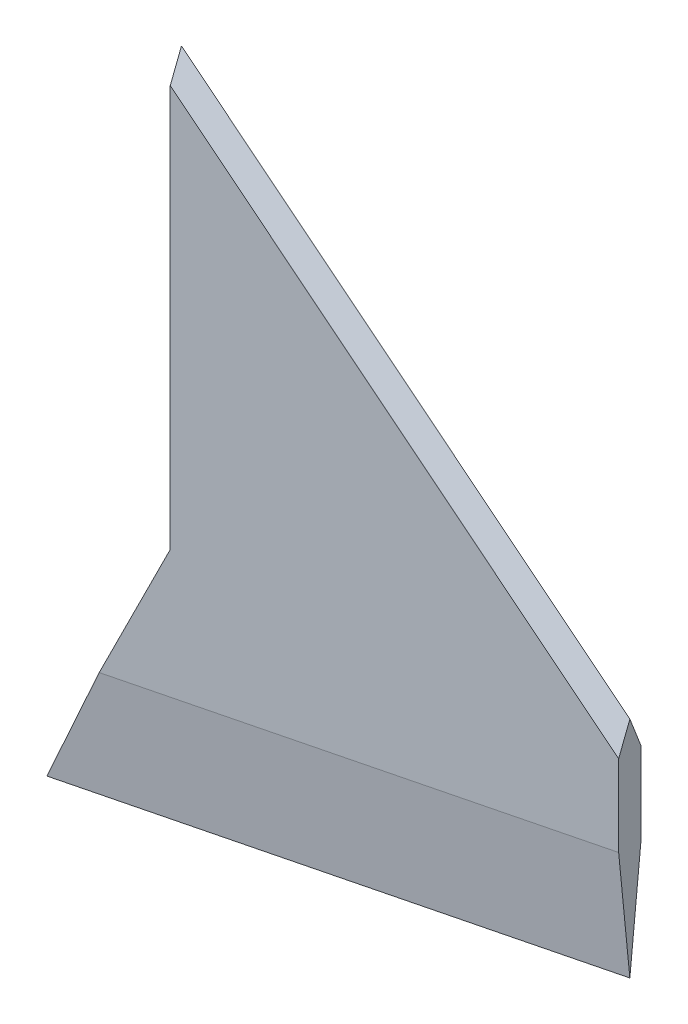
ISO-10303-21;
HEADER;
FILE_DESCRIPTION(('STEP AP214'),'2;1');
FILE_NAME('part.step','',(''),(''),'','','');
FILE_SCHEMA(('AUTOMOTIVE_DESIGN { 1 0 10303 214 1 1 1 1 }'));
ENDSEC;
DATA;
#1=APPLICATION_CONTEXT('core data for automotive mechanical design processes');
#2=APPLICATION_PROTOCOL_DEFINITION('international standard','automotive_design',2000,#1);
#3=PRODUCT_CONTEXT('',#1,'mechanical');
#4=PRODUCT('Part','Part','',(#3));
#5=PRODUCT_RELATED_PRODUCT_CATEGORY('part','',(#4));
#6=PRODUCT_DEFINITION_FORMATION('','',#4);
#7=PRODUCT_DEFINITION_CONTEXT('part definition',#1,'design');
#8=PRODUCT_DEFINITION('design','',#6,#7);
#9=PRODUCT_DEFINITION_SHAPE('','',#8);
#10=(LENGTH_UNIT() NAMED_UNIT(*) SI_UNIT(.MILLI.,.METRE.));
#11=(NAMED_UNIT(*) PLANE_ANGLE_UNIT() SI_UNIT($,.RADIAN.));
#12=(NAMED_UNIT(*) SI_UNIT($,.STERADIAN.) SOLID_ANGLE_UNIT());
#13=UNCERTAINTY_MEASURE_WITH_UNIT(LENGTH_MEASURE(1.E-05),#10,'distance_accuracy_value','');
#14=(GEOMETRIC_REPRESENTATION_CONTEXT(3) GLOBAL_UNCERTAINTY_ASSIGNED_CONTEXT((#13)) GLOBAL_UNIT_ASSIGNED_CONTEXT((#10,
#11,#12)) REPRESENTATION_CONTEXT('',''));
#15=CARTESIAN_POINT('',(0.,0.,0.));
#16=DIRECTION('',(0.,0.,1.));
#17=DIRECTION('',(1.,0.,0.));
#18=AXIS2_PLACEMENT_3D('',#15,#16,#17);
#19=CARTESIAN_POINT('',(-21.6,10.8,5.));
#20=DIRECTION('',(-0.894427190999916,0.447213595499958,0.));
#21=DIRECTION('',(-0.447213595499958,-0.894427190999916,0.));
#22=AXIS2_PLACEMENT_3D('',#19,#20,#21);
#23=PLANE('',#22);
#24=DIRECTION('',(0.447213595499958,0.894427190999916,0.));
#25=VECTOR('',#24,1.);
#26=CARTESIAN_POINT('',(-21.6,10.8,0.));
#27=LINE('',#26,#25);
#28=CARTESIAN_POINT('',(-15.8360569066862,22.3278861866275,0.));
#29=VERTEX_POINT('',#28);
#30=CARTESIAN_POINT('',(0.,54.,0.));
#31=VERTEX_POINT('',#30);
#32=EDGE_CURVE('E131',#29,#31,#27,.T.);
#33=ORIENTED_EDGE('',*,*,#32,.F.);
#34=DIRECTION('',(0.445826830251017,0.891653660502034,-0.0786904514007603));
#35=VECTOR('',#34,1.);
#36=CARTESIAN_POINT('',(-21.7397201582875,10.5205596834251,1.04202325805519));
#37=LINE('',#36,#35);
#38=CARTESIAN_POINT('',(-30.,-5.99999999999999,2.49999999999999));
#39=VERTEX_POINT('',#38);
#40=EDGE_CURVE('E11',#29,#39,#37,.F.);
#41=ORIENTED_EDGE('',*,*,#40,.T.);
#42=DIRECTION('',(0.445826830251017,0.891653660502033,0.0786904514007603));
#43=VECTOR('',#42,1.);
#44=CARTESIAN_POINT('',(-21.5643085856923,10.8713828286153,3.98893767765308));
#45=LINE('',#44,#43);
#46=CARTESIAN_POINT('',(-15.8360569066862,22.3278861866276,5.));
#47=VERTEX_POINT('',#46);
#48=EDGE_CURVE('E107',#39,#47,#45,.T.);
#49=ORIENTED_EDGE('',*,*,#48,.T.);
#50=DIRECTION('',(0.447213595499958,0.894427190999916,0.));
#51=VECTOR('',#50,1.);
#52=CARTESIAN_POINT('',(-21.6,10.8,5.));
#53=LINE('',#52,#51);
#54=CARTESIAN_POINT('',(0.,54.,5.));
#55=VERTEX_POINT('',#54);
#56=EDGE_CURVE('E102',#47,#55,#53,.T.);
#57=ORIENTED_EDGE('',*,*,#56,.T.);
#58=DIRECTION('',(0.,0.,-1.));
#59=VECTOR('',#58,1.);
#60=CARTESIAN_POINT('',(0.,54.,5.));
#61=LINE('',#60,#59);
#62=EDGE_CURVE('E104',#55,#31,#61,.T.);
#63=ORIENTED_EDGE('',*,*,#62,.T.);
#64=EDGE_LOOP('',(#33,#41,#49,#57,#63));
#65=FACE_BOUND('',#64,.T.);
#66=ADVANCED_FACE('F43',(#65),#23,.T.);
#67=CARTESIAN_POINT('',(100.,0.,5.));
#68=DIRECTION('',(1.,0.,0.));
#69=DIRECTION('',(0.,0.,-1.));
#70=AXIS2_PLACEMENT_3D('',#67,#68,#69);
#71=PLANE('',#70);
#72=DIRECTION('',(0.,-0.995226703056239,-0.0975900072948501));
#73=VECTOR('',#72,1.);
#74=CARTESIAN_POINT('',(100.,0.433286643504398,0.581325899583761));
#75=LINE('',#74,#73);
#76=CARTESIAN_POINT('',(100.,45.4950975679648,5.));
#77=VERTEX_POINT('',#76);
#78=CARTESIAN_POINT('',(100.,20.,2.49999999999999));
#79=VERTEX_POINT('',#78);
#80=EDGE_CURVE('E152',#77,#79,#75,.T.);
#81=ORIENTED_EDGE('',*,*,#80,.T.);
#82=DIRECTION('',(0.,-0.995226703056239,0.09759000729485));
#83=VECTOR('',#82,1.);
#84=CARTESIAN_POINT('',(100.,-0.0523342625520425,4.46629314803528));
#85=LINE('',#84,#83);
#86=CARTESIAN_POINT('',(100.,45.4950975679647,0.));
#87=VERTEX_POINT('',#86);
#88=EDGE_CURVE('E66',#79,#87,#85,.F.);
#89=ORIENTED_EDGE('',*,*,#88,.T.);
#90=DIRECTION('',(0.,-1.,0.));
#91=VECTOR('',#90,1.);
#92=CARTESIAN_POINT('',(100.,0.,0.));
#93=LINE('',#92,#91);
#94=CARTESIAN_POINT('',(100.,63.5968757625671,0.));
#95=VERTEX_POINT('',#94);
#96=EDGE_CURVE('E133',#95,#87,#93,.T.);
#97=ORIENTED_EDGE('',*,*,#96,.F.);
#98=DIRECTION('',(0.,0.931517508007696,0.363696483726653));
#99=VECTOR('',#98,1.);
#100=CARTESIAN_POINT('',(100.,10.1062333647397,-20.8845871227671));
#101=LINE('',#100,#99);
#102=CARTESIAN_POINT('',(100.,70.,2.49999999999997));
#103=VERTEX_POINT('',#102);
#104=EDGE_CURVE('E146',#95,#103,#101,.T.);
#105=ORIENTED_EDGE('',*,*,#104,.T.);
#106=DIRECTION('',(0.,0.931517508007697,-0.363696483726651));
#107=VECTOR('',#106,1.);
#108=CARTESIAN_POINT('',(100.,8.41228515377856,26.5459627841426));
#109=LINE('',#108,#107);
#110=CARTESIAN_POINT('',(100.,63.596875762567,5.));
#111=VERTEX_POINT('',#110);
#112=EDGE_CURVE('E138',#103,#111,#109,.F.);
#113=ORIENTED_EDGE('',*,*,#112,.T.);
#114=DIRECTION('',(0.,-1.,0.));
#115=VECTOR('',#114,1.);
#116=CARTESIAN_POINT('',(100.,0.,5.));
#117=LINE('',#116,#115);
#118=EDGE_CURVE('E112',#111,#77,#117,.T.);
#119=ORIENTED_EDGE('',*,*,#118,.T.);
#120=EDGE_LOOP('',(#81,#89,#97,#105,#113,#119));
#121=FACE_BOUND('',#120,.T.);
#122=ADVANCED_FACE('F163',(#121),#71,.T.);
#123=CARTESIAN_POINT('',(0.,0.,5.));
#124=DIRECTION('',(-1.,0.,0.));
#125=DIRECTION('',(0.,0.,1.));
#126=AXIS2_PLACEMENT_3D('',#123,#124,#125);
#127=PLANE('',#126);
#128=DIRECTION('',(0.,-0.931517508007697,0.363696483726651));
#129=VECTOR('',#128,1.);
#130=CARTESIAN_POINT('',(0.,18.994295735789,53.6491341595195));
#131=LINE('',#130,#129);
#132=CARTESIAN_POINT('',(0.,143.596875762567,5.));
#133=VERTEX_POINT('',#132);
#134=CARTESIAN_POINT('',(0.,150.,2.49999999999997));
#135=VERTEX_POINT('',#134);
#136=EDGE_CURVE('E141',#133,#135,#131,.F.);
#137=ORIENTED_EDGE('',*,*,#136,.T.);
#138=DIRECTION('',(0.,-0.931517508007696,-0.363696483726653));
#139=VECTOR('',#138,1.);
#140=CARTESIAN_POINT('',(0.,20.6882439467502,-47.9877584981441));
#141=LINE('',#140,#139);
#142=CARTESIAN_POINT('',(0.,143.596875762567,0.));
#143=VERTEX_POINT('',#142);
#144=EDGE_CURVE('E148',#135,#143,#141,.T.);
#145=ORIENTED_EDGE('',*,*,#144,.T.);
#146=DIRECTION('',(0.,1.,0.));
#147=VECTOR('',#146,1.);
#148=CARTESIAN_POINT('',(0.,0.,0.));
#149=LINE('',#148,#147);
#150=EDGE_CURVE('E113',#31,#143,#149,.T.);
#151=ORIENTED_EDGE('',*,*,#150,.F.);
#152=ORIENTED_EDGE('',*,*,#62,.F.);
#153=DIRECTION('',(0.,1.,0.));
#154=VECTOR('',#153,1.);
#155=CARTESIAN_POINT('',(0.,0.,5.));
#156=LINE('',#155,#154);
#157=EDGE_CURVE('E118',#55,#133,#156,.T.);
#158=ORIENTED_EDGE('',*,*,#157,.T.);
#159=EDGE_LOOP('',(#137,#145,#151,#152,#158));
#160=FACE_BOUND('',#159,.T.);
#161=ADVANCED_FACE('F117',(#160),#127,.T.);
#162=CARTESIAN_POINT('',(0.,0.,5.));
#163=DIRECTION('',(0.,0.,1.));
#164=DIRECTION('',(1.,0.,0.));
#165=AXIS2_PLACEMENT_3D('',#162,#163,#164);
#166=PLANE('',#165);
#167=ORIENTED_EDGE('',*,*,#56,.F.);
#168=DIRECTION('',(0.98058067569092,0.196116135138184,0.));
#169=VECTOR('',#168,1.);
#170=CARTESIAN_POINT('',(95.0970966215452,44.5145168922739,5.));
#171=LINE('',#170,#169);
#172=EDGE_CURVE('E150',#47,#77,#171,.T.);
#173=ORIENTED_EDGE('',*,*,#172,.T.);
#174=ORIENTED_EDGE('',*,*,#118,.F.);
#175=DIRECTION('',(-0.78086880944303,0.624695047554424,0.));
#176=VECTOR('',#175,1.);
#177=CARTESIAN_POINT('',(70.0472564695448,87.5590705869311,5.));
#178=LINE('',#177,#176);
#179=EDGE_CURVE('E126',#111,#133,#178,.T.);
#180=ORIENTED_EDGE('',*,*,#179,.T.);
#181=ORIENTED_EDGE('',*,*,#157,.F.);
#182=EDGE_LOOP('',(#167,#173,#174,#180,#181));
#183=FACE_BOUND('',#182,.T.);
#184=ADVANCED_FACE('F123',(#183),#166,.T.);
#185=CARTESIAN_POINT('',(0.,0.,0.));
#186=DIRECTION('',(0.,0.,1.));
#187=DIRECTION('',(1.,0.,0.));
#188=AXIS2_PLACEMENT_3D('',#185,#186,#187);
#189=PLANE('',#188);
#190=ORIENTED_EDGE('',*,*,#96,.T.);
#191=DIRECTION('',(-0.98058067569092,-0.196116135138184,0.));
#192=VECTOR('',#191,1.);
#193=CARTESIAN_POINT('',(-4.90290337845476,24.5145168922738,0.));
#194=LINE('',#193,#192);
#195=EDGE_CURVE('E52',#87,#29,#194,.T.);
#196=ORIENTED_EDGE('',*,*,#195,.T.);
#197=ORIENTED_EDGE('',*,*,#32,.T.);
#198=ORIENTED_EDGE('',*,*,#150,.T.);
#199=DIRECTION('',(0.78086880944303,-0.624695047554424,0.));
#200=VECTOR('',#199,1.);
#201=CARTESIAN_POINT('',(96.8765247622279,66.0956559527848,0.));
#202=LINE('',#201,#200);
#203=EDGE_CURVE('E143',#143,#95,#202,.T.);
#204=ORIENTED_EDGE('',*,*,#203,.T.);
#205=EDGE_LOOP('',(#190,#196,#197,#198,#204));
#206=FACE_BOUND('',#205,.T.);
#207=ADVANCED_FACE('F172',(#206),#189,.F.);
#208=CARTESIAN_POINT('',(73.170731707317,91.4634146341463,2.49999999999997));
#209=DIRECTION('',(-0.279372118307829,-0.349215147884786,-0.894427190999918));
#210=DIRECTION('',(0.78086880944303,-0.624695047554424,0.));
#211=AXIS2_PLACEMENT_3D('',#208,#209,#210);
#212=PLANE('',#211);
#213=ORIENTED_EDGE('',*,*,#136,.F.);
#214=ORIENTED_EDGE('',*,*,#179,.F.);
#215=ORIENTED_EDGE('',*,*,#112,.F.);
#216=DIRECTION('',(0.78086880944303,-0.624695047554424,0.));
#217=VECTOR('',#216,1.);
#218=CARTESIAN_POINT('',(73.170731707317,91.4634146341463,2.49999999999997));
#219=LINE('',#218,#217);
#220=EDGE_CURVE('E121',#135,#103,#219,.T.);
#221=ORIENTED_EDGE('',*,*,#220,.F.);
#222=EDGE_LOOP('',(#213,#214,#215,#221));
#223=FACE_BOUND('',#222,.T.);
#224=ADVANCED_FACE('F167',(#223),#212,.F.);
#225=CARTESIAN_POINT('',(70.0472564695449,87.5590705869312,0.));
#226=DIRECTION('',(0.27937211830783,0.349215147884788,-0.894427190999917));
#227=DIRECTION('',(-0.78086880944303,0.624695047554424,0.));
#228=AXIS2_PLACEMENT_3D('',#225,#226,#227);
#229=PLANE('',#228);
#230=ORIENTED_EDGE('',*,*,#144,.F.);
#231=ORIENTED_EDGE('',*,*,#220,.T.);
#232=ORIENTED_EDGE('',*,*,#104,.F.);
#233=ORIENTED_EDGE('',*,*,#203,.F.);
#234=EDGE_LOOP('',(#230,#231,#232,#233));
#235=FACE_BOUND('',#234,.T.);
#236=ADVANCED_FACE('F170',(#235),#229,.T.);
#237=CARTESIAN_POINT('',(-4.90290337845477,24.5145168922739,5.));
#238=DIRECTION('',(0.0195142848062734,-0.0975714240313673,0.995037190209989));
#239=DIRECTION('',(-0.98058067569092,-0.196116135138184,0.));
#240=AXIS2_PLACEMENT_3D('',#237,#238,#239);
#241=PLANE('',#240);
#242=ORIENTED_EDGE('',*,*,#48,.F.);
#243=DIRECTION('',(-0.98058067569092,-0.196116135138184,0.));
#244=VECTOR('',#243,1.);
#245=CARTESIAN_POINT('',(-30.,-5.99999999999999,2.49999999999999));
#246=LINE('',#245,#244);
#247=EDGE_CURVE('E154',#79,#39,#246,.T.);
#248=ORIENTED_EDGE('',*,*,#247,.F.);
#249=ORIENTED_EDGE('',*,*,#80,.F.);
#250=ORIENTED_EDGE('',*,*,#172,.F.);
#251=EDGE_LOOP('',(#242,#248,#249,#250));
#252=FACE_BOUND('',#251,.T.);
#253=ADVANCED_FACE('F162',(#252),#241,.T.);
#254=CARTESIAN_POINT('',(0.,0.,2.5));
#255=DIRECTION('',(-0.0195142848062734,0.0975714240313673,0.995037190209989));
#256=DIRECTION('',(0.98058067569092,0.196116135138184,0.));
#257=AXIS2_PLACEMENT_3D('',#254,#255,#256);
#258=PLANE('',#257);
#259=ORIENTED_EDGE('',*,*,#40,.F.);
#260=ORIENTED_EDGE('',*,*,#195,.F.);
#261=ORIENTED_EDGE('',*,*,#88,.F.);
#262=ORIENTED_EDGE('',*,*,#247,.T.);
#263=EDGE_LOOP('',(#259,#260,#261,#262));
#264=FACE_BOUND('',#263,.T.);
#265=ADVANCED_FACE('F46',(#264),#258,.F.);
#266=CLOSED_SHELL('',(#66,#122,#161,#184,#207,#224,#236,#253,#265));
#267=MANIFOLD_SOLID_BREP('B2',#266);
#268=ADVANCED_BREP_SHAPE_REPRESENTATION('',(#18,#267),#14);
#269=SHAPE_DEFINITION_REPRESENTATION(#9,#268);
ENDSEC;
END-ISO-10303-21;
